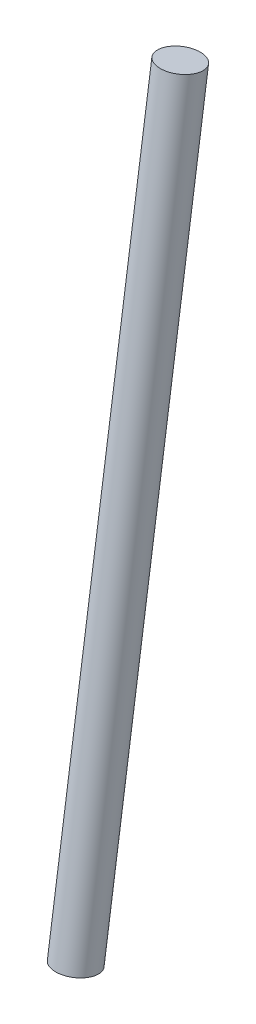
ISO-10303-21;
HEADER;
FILE_DESCRIPTION(('STEP AP214'),'2;1');
FILE_NAME('part.step','',(''),(''),'','','');
FILE_SCHEMA(('AUTOMOTIVE_DESIGN { 1 0 10303 214 1 1 1 1 }'));
ENDSEC;
DATA;
#1=APPLICATION_CONTEXT('core data for automotive mechanical design processes');
#2=APPLICATION_PROTOCOL_DEFINITION('international standard','automotive_design',2000,#1);
#3=PRODUCT_CONTEXT('',#1,'mechanical');
#4=PRODUCT('Part','Part','',(#3));
#5=PRODUCT_RELATED_PRODUCT_CATEGORY('part','',(#4));
#6=PRODUCT_DEFINITION_FORMATION('','',#4);
#7=PRODUCT_DEFINITION_CONTEXT('part definition',#1,'design');
#8=PRODUCT_DEFINITION('design','',#6,#7);
#9=PRODUCT_DEFINITION_SHAPE('','',#8);
#10=(LENGTH_UNIT() NAMED_UNIT(*) SI_UNIT(.MILLI.,.METRE.));
#11=(NAMED_UNIT(*) PLANE_ANGLE_UNIT() SI_UNIT($,.RADIAN.));
#12=(NAMED_UNIT(*) SI_UNIT($,.STERADIAN.) SOLID_ANGLE_UNIT());
#13=UNCERTAINTY_MEASURE_WITH_UNIT(LENGTH_MEASURE(1.E-05),#10,'distance_accuracy_value','');
#14=(GEOMETRIC_REPRESENTATION_CONTEXT(3) GLOBAL_UNCERTAINTY_ASSIGNED_CONTEXT((#13)) GLOBAL_UNIT_ASSIGNED_CONTEXT((#10,
#11,#12)) REPRESENTATION_CONTEXT('',''));
#15=CARTESIAN_POINT('',(0.,0.,0.));
#16=DIRECTION('',(0.,0.,1.));
#17=DIRECTION('',(1.,0.,0.));
#18=AXIS2_PLACEMENT_3D('',#15,#16,#17);
#19=CARTESIAN_POINT('',(-82.9999999999992,712.372381337401,-417.293155031297));
#20=DIRECTION('',(0.,0.989899580336065,-0.141770310186876));
#21=DIRECTION('',(0.,0.141770310186876,0.989899580336065));
#22=AXIS2_PLACEMENT_3D('',#19,#20,#21);
#23=PLANE('',#22);
#24=CARTESIAN_POINT('',(-81.9999999999971,712.230611027214,-418.283054611633));
#25=DIRECTION('',(0.,0.989899580336059,-0.141770310186915));
#26=DIRECTION('',(0.,0.141770310186915,0.989899580336059));
#27=AXIS2_PLACEMENT_3D('',#24,#25,#26);
#28=CIRCLE('',#27,1.00000000000002);
#29=CARTESIAN_POINT('',(-81.9999999999971,712.372381337401,-417.293155031297));
#30=VERTEX_POINT('',#29);
#31=EDGE_CURVE('E18',#30,#30,#28,.F.);
#32=ORIENTED_EDGE('',*,*,#31,.F.);
#33=EDGE_LOOP('',(#32));
#34=FACE_BOUND('',#33,.T.);
#35=ADVANCED_FACE('F15',(#34),#23,.T.);
#36=CARTESIAN_POINT('',(-80.9999999999987,676.221052762965,-412.115675247007));
#37=DIRECTION('',(0.,-0.989899580336065,0.141770310186876));
#38=DIRECTION('',(0.,-0.141770310186876,-0.989899580336065));
#39=AXIS2_PLACEMENT_3D('',#36,#37,#38);
#40=PLANE('',#39);
#41=CARTESIAN_POINT('',(-81.9999999999986,676.079282452778,-413.105574827343));
#42=DIRECTION('',(0.,0.989899580336059,-0.141770310186915));
#43=DIRECTION('',(0.,0.141770310186915,0.989899580336059));
#44=AXIS2_PLACEMENT_3D('',#41,#42,#43);
#45=CIRCLE('',#44,1.00000000000002);
#46=CARTESIAN_POINT('',(-81.9999999999986,676.221052762965,-412.115675247007));
#47=VERTEX_POINT('',#46);
#48=EDGE_CURVE('E10',#47,#47,#45,.T.);
#49=ORIENTED_EDGE('',*,*,#48,.F.);
#50=EDGE_LOOP('',(#49));
#51=FACE_BOUND('',#50,.T.);
#52=ADVANCED_FACE('F30',(#51),#40,.T.);
#53=CARTESIAN_POINT('',(-81.9999999999986,675.940361558658,-413.085679013018));
#54=DIRECTION('',(0.,0.989899580336059,-0.141770310186915));
#55=DIRECTION('',(0.,0.141770310186915,0.989899580336059));
#56=AXIS2_PLACEMENT_3D('',#53,#54,#55);
#57=CYLINDRICAL_SURFACE('',#56,1.00000000000002);
#58=ORIENTED_EDGE('',*,*,#31,.T.);
#59=EDGE_LOOP('',(#58));
#60=FACE_BOUND('',#59,.T.);
#61=ORIENTED_EDGE('',*,*,#48,.T.);
#62=EDGE_LOOP('',(#61));
#63=FACE_BOUND('',#62,.T.);
#64=ADVANCED_FACE('F27',(#60,#63),#57,.T.);
#65=CLOSED_SHELL('',(#35,#52,#64));
#66=MANIFOLD_SOLID_BREP('B1',#65);
#67=ADVANCED_BREP_SHAPE_REPRESENTATION('',(#18,#66),#14);
#68=SHAPE_DEFINITION_REPRESENTATION(#9,#67);
ENDSEC;
END-ISO-10303-21;
